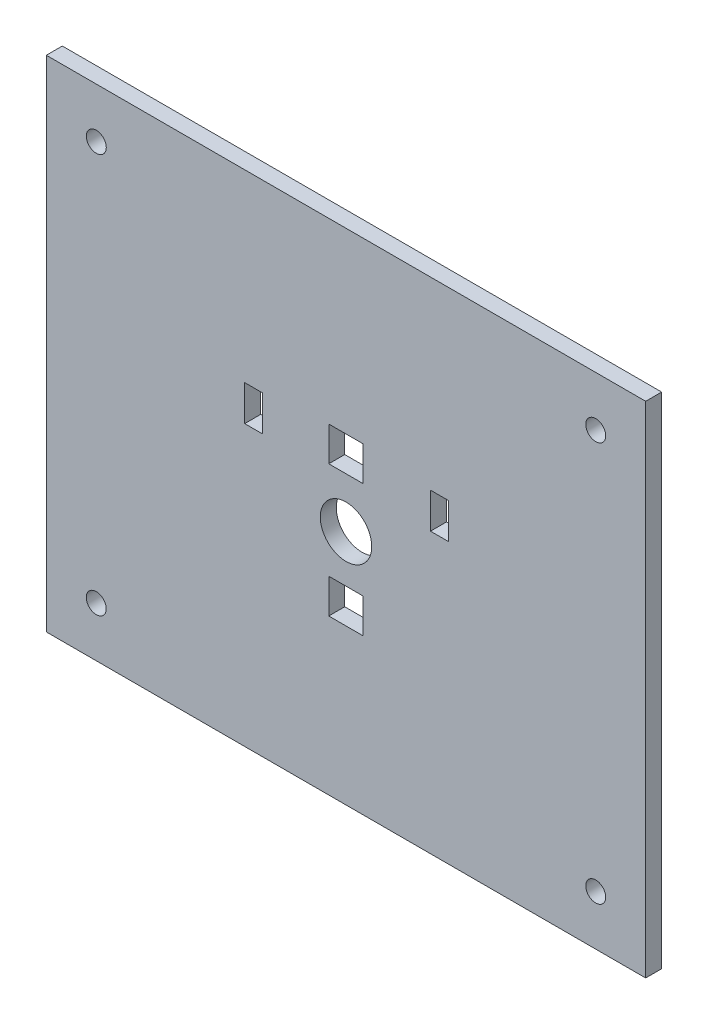
ISO-10303-21;
HEADER;
FILE_DESCRIPTION(('STEP AP214'),'2;1');
FILE_NAME('part.step','',(''),(''),'','','');
FILE_SCHEMA(('AUTOMOTIVE_DESIGN { 1 0 10303 214 1 1 1 1 }'));
ENDSEC;
DATA;
#1=APPLICATION_CONTEXT('core data for automotive mechanical design processes');
#2=APPLICATION_PROTOCOL_DEFINITION('international standard','automotive_design',2000,#1);
#3=PRODUCT_CONTEXT('',#1,'mechanical');
#4=PRODUCT('Part','Part','',(#3));
#5=PRODUCT_RELATED_PRODUCT_CATEGORY('part','',(#4));
#6=PRODUCT_DEFINITION_FORMATION('','',#4);
#7=PRODUCT_DEFINITION_CONTEXT('part definition',#1,'design');
#8=PRODUCT_DEFINITION('design','',#6,#7);
#9=PRODUCT_DEFINITION_SHAPE('','',#8);
#10=(LENGTH_UNIT() NAMED_UNIT(*) SI_UNIT(.MILLI.,.METRE.));
#11=(NAMED_UNIT(*) PLANE_ANGLE_UNIT() SI_UNIT($,.RADIAN.));
#12=(NAMED_UNIT(*) SI_UNIT($,.STERADIAN.) SOLID_ANGLE_UNIT());
#13=UNCERTAINTY_MEASURE_WITH_UNIT(LENGTH_MEASURE(1.E-05),#10,'distance_accuracy_value','');
#14=(GEOMETRIC_REPRESENTATION_CONTEXT(3) GLOBAL_UNCERTAINTY_ASSIGNED_CONTEXT((#13)) GLOBAL_UNIT_ASSIGNED_CONTEXT((#10,
#11,#12)) REPRESENTATION_CONTEXT('',''));
#15=CARTESIAN_POINT('',(0.,0.,0.));
#16=DIRECTION('',(0.,0.,1.));
#17=DIRECTION('',(1.,0.,0.));
#18=AXIS2_PLACEMENT_3D('',#15,#16,#17);
#19=CARTESIAN_POINT('',(0.,0.,1.6));
#20=DIRECTION('',(0.,0.,1.));
#21=DIRECTION('',(1.,0.,0.));
#22=AXIS2_PLACEMENT_3D('',#19,#20,#21);
#23=PLANE('',#22);
#24=CARTESIAN_POINT('',(137.002348606175,55.0046290037253,1.6));
#25=DIRECTION('',(0.,0.,1.));
#26=DIRECTION('',(1.,0.,0.));
#27=AXIS2_PLACEMENT_3D('',#24,#25,#26);
#28=CIRCLE('',#27,0.999999999999998);
#29=CARTESIAN_POINT('',(138.002348606175,55.0046290037253,1.6));
#30=VERTEX_POINT('',#29);
#31=EDGE_CURVE('E245',#30,#30,#28,.T.);
#32=ORIENTED_EDGE('',*,*,#31,.F.);
#33=EDGE_LOOP('',(#32));
#34=FACE_BOUND('',#33,.T.);
#35=DIRECTION('',(0.,-1.,0.));
#36=VECTOR('',#35,1.);
#37=CARTESIAN_POINT('',(101.86100024,77.9969992,1.6));
#38=LINE('',#37,#36);
#39=CARTESIAN_POINT('',(101.86100024,81.5529992,1.6));
#40=VERTEX_POINT('',#39);
#41=CARTESIAN_POINT('',(101.86100024,77.9969992,1.6));
#42=VERTEX_POINT('',#41);
#43=EDGE_CURVE('E259',#40,#42,#38,.T.);
#44=ORIENTED_EDGE('',*,*,#43,.F.);
#45=DIRECTION('',(-1.,0.,0.));
#46=VECTOR('',#45,1.);
#47=CARTESIAN_POINT('',(101.86100024,81.5529992,1.6));
#48=LINE('',#47,#46);
#49=CARTESIAN_POINT('',(103.63900024,81.5529992,1.6));
#50=VERTEX_POINT('',#49);
#51=EDGE_CURVE('E257',#50,#40,#48,.T.);
#52=ORIENTED_EDGE('',*,*,#51,.F.);
#53=DIRECTION('',(0.,1.,0.));
#54=VECTOR('',#53,1.);
#55=CARTESIAN_POINT('',(103.63900024,77.9969992,1.6));
#56=LINE('',#55,#54);
#57=CARTESIAN_POINT('',(103.63900024,77.9969992,1.6));
#58=VERTEX_POINT('',#57);
#59=EDGE_CURVE('E265',#58,#50,#56,.T.);
#60=ORIENTED_EDGE('',*,*,#59,.F.);
#61=DIRECTION('',(1.,0.,0.));
#62=VECTOR('',#61,1.);
#63=CARTESIAN_POINT('',(101.86100024,77.9969992,1.6));
#64=LINE('',#63,#62);
#65=EDGE_CURVE('E262',#42,#58,#64,.T.);
#66=ORIENTED_EDGE('',*,*,#65,.F.);
#67=EDGE_LOOP('',(#44,#52,#60,#66));
#68=FACE_BOUND('',#67,.T.);
#69=CARTESIAN_POINT('',(87.0023486061747,95.0046290037253,1.6));
#70=DIRECTION('',(0.,0.,1.));
#71=DIRECTION('',(1.,0.,0.));
#72=AXIS2_PLACEMENT_3D('',#69,#70,#71);
#73=CIRCLE('',#72,0.999999999999998);
#74=CARTESIAN_POINT('',(88.0023486061747,95.0046290037253,1.6));
#75=VERTEX_POINT('',#74);
#76=EDGE_CURVE('E288',#75,#75,#73,.T.);
#77=ORIENTED_EDGE('',*,*,#76,.F.);
#78=EDGE_LOOP('',(#77));
#79=FACE_BOUND('',#78,.T.);
#80=DIRECTION('',(-1.,0.,0.));
#81=VECTOR('',#80,1.);
#82=CARTESIAN_POINT('',(120.4609986,81.52800052,1.6));
#83=LINE('',#82,#81);
#84=CARTESIAN_POINT('',(122.2389986,81.52800052,1.6));
#85=VERTEX_POINT('',#84);
#86=CARTESIAN_POINT('',(120.4609986,81.52800052,1.6));
#87=VERTEX_POINT('',#86);
#88=EDGE_CURVE('E302',#85,#87,#83,.T.);
#89=ORIENTED_EDGE('',*,*,#88,.F.);
#90=DIRECTION('',(0.,1.,0.));
#91=VECTOR('',#90,1.);
#92=CARTESIAN_POINT('',(122.2389986,77.97200052,1.6));
#93=LINE('',#92,#91);
#94=CARTESIAN_POINT('',(122.2389986,77.97200052,1.6));
#95=VERTEX_POINT('',#94);
#96=EDGE_CURVE('E300',#95,#85,#93,.T.);
#97=ORIENTED_EDGE('',*,*,#96,.F.);
#98=DIRECTION('',(1.,0.,0.));
#99=VECTOR('',#98,1.);
#100=CARTESIAN_POINT('',(120.4609986,77.97200052,1.6));
#101=LINE('',#100,#99);
#102=CARTESIAN_POINT('',(120.4609986,77.97200052,1.6));
#103=VERTEX_POINT('',#102);
#104=EDGE_CURVE('E308',#103,#95,#101,.T.);
#105=ORIENTED_EDGE('',*,*,#104,.F.);
#106=DIRECTION('',(0.,-1.,0.));
#107=VECTOR('',#106,1.);
#108=CARTESIAN_POINT('',(120.4609986,77.97200052,1.6));
#109=LINE('',#108,#107);
#110=EDGE_CURVE('E305',#87,#103,#109,.T.);
#111=ORIENTED_EDGE('',*,*,#110,.F.);
#112=EDGE_LOOP('',(#89,#97,#105,#111));
#113=FACE_BOUND('',#112,.T.);
#114=DIRECTION('',(0.,1.,0.));
#115=VECTOR('',#114,1.);
#116=CARTESIAN_POINT('',(142.002348606175,100.004629003725,1.6));
#117=LINE('',#116,#115);
#118=CARTESIAN_POINT('',(142.002348606175,50.0046290037253,1.6));
#119=VERTEX_POINT('',#118);
#120=CARTESIAN_POINT('',(142.002348606175,100.004629003725,1.6));
#121=VERTEX_POINT('',#120);
#122=EDGE_CURVE('E331',#119,#121,#117,.T.);
#123=ORIENTED_EDGE('',*,*,#122,.T.);
#124=DIRECTION('',(-1.,0.,0.));
#125=VECTOR('',#124,1.);
#126=CARTESIAN_POINT('',(82.0023486061747,100.004629003725,1.6));
#127=LINE('',#126,#125);
#128=CARTESIAN_POINT('',(82.0023486061747,100.004629003725,1.6));
#129=VERTEX_POINT('',#128);
#130=EDGE_CURVE('E334',#121,#129,#127,.T.);
#131=ORIENTED_EDGE('',*,*,#130,.T.);
#132=DIRECTION('',(0.,-1.,0.));
#133=VECTOR('',#132,1.);
#134=CARTESIAN_POINT('',(82.0023486061747,100.004629003725,1.6));
#135=LINE('',#134,#133);
#136=CARTESIAN_POINT('',(82.0023486061747,50.0046290037253,1.6));
#137=VERTEX_POINT('',#136);
#138=EDGE_CURVE('E337',#129,#137,#135,.T.);
#139=ORIENTED_EDGE('',*,*,#138,.T.);
#140=DIRECTION('',(1.,0.,0.));
#141=VECTOR('',#140,1.);
#142=CARTESIAN_POINT('',(82.0023486061747,50.0046290037253,1.6));
#143=LINE('',#142,#141);
#144=EDGE_CURVE('E339',#137,#119,#143,.T.);
#145=ORIENTED_EDGE('',*,*,#144,.T.);
#146=EDGE_LOOP('',(#123,#131,#139,#145));
#147=FACE_BOUND('',#146,.T.);
#148=CARTESIAN_POINT('',(112.002348606175,73.693071841758,1.6));
#149=DIRECTION('',(0.,0.,1.));
#150=DIRECTION('',(1.,0.,0.));
#151=AXIS2_PLACEMENT_3D('',#148,#149,#150);
#152=CIRCLE('',#151,2.57574226018455);
#153=CARTESIAN_POINT('',(114.578090866359,73.693071841758,1.6));
#154=VERTEX_POINT('',#153);
#155=EDGE_CURVE('E294',#154,#154,#152,.T.);
#156=ORIENTED_EDGE('',*,*,#155,.F.);
#157=EDGE_LOOP('',(#156));
#158=FACE_BOUND('',#157,.T.);
#159=CARTESIAN_POINT('',(137.002348606175,95.0046290037253,1.6));
#160=DIRECTION('',(0.,0.,1.));
#161=DIRECTION('',(-1.,0.,0.));
#162=AXIS2_PLACEMENT_3D('',#159,#160,#161);
#163=CIRCLE('',#162,0.999999999999998);
#164=CARTESIAN_POINT('',(136.002348606175,95.0046290037253,1.6));
#165=VERTEX_POINT('',#164);
#166=EDGE_CURVE('E251',#165,#165,#163,.T.);
#167=ORIENTED_EDGE('',*,*,#166,.F.);
#168=EDGE_LOOP('',(#167));
#169=FACE_BOUND('',#168,.T.);
#170=CARTESIAN_POINT('',(87.0023486061747,55.0046290037253,1.6));
#171=DIRECTION('',(0.,0.,1.));
#172=DIRECTION('',(-1.,0.,0.));
#173=AXIS2_PLACEMENT_3D('',#170,#171,#172);
#174=CIRCLE('',#173,0.999999999999998);
#175=CARTESIAN_POINT('',(86.0023486061747,55.0046290037253,1.6));
#176=VERTEX_POINT('',#175);
#177=EDGE_CURVE('E239',#176,#176,#174,.T.);
#178=ORIENTED_EDGE('',*,*,#177,.F.);
#179=EDGE_LOOP('',(#178));
#180=FACE_BOUND('',#179,.T.);
#181=DIRECTION('',(1.,0.,0.));
#182=VECTOR('',#181,1.);
#183=CARTESIAN_POINT('',(110.27499916,78.7202007,1.6));
#184=LINE('',#183,#182);
#185=CARTESIAN_POINT('',(110.27499916,78.7202007,1.6));
#186=VERTEX_POINT('',#185);
#187=CARTESIAN_POINT('',(113.72499988,78.7202007,1.6));
#188=VERTEX_POINT('',#187);
#189=EDGE_CURVE('E210',#186,#188,#184,.T.);
#190=ORIENTED_EDGE('',*,*,#189,.F.);
#191=DIRECTION('',(0.,-1.,0.));
#192=VECTOR('',#191,1.);
#193=CARTESIAN_POINT('',(110.27499916,78.7202007,1.6));
#194=LINE('',#193,#192);
#195=CARTESIAN_POINT('',(110.27499916,82.17020142,1.6));
#196=VERTEX_POINT('',#195);
#197=EDGE_CURVE('E208',#196,#186,#194,.T.);
#198=ORIENTED_EDGE('',*,*,#197,.F.);
#199=DIRECTION('',(-1.,0.,0.));
#200=VECTOR('',#199,1.);
#201=CARTESIAN_POINT('',(110.27499916,82.17020142,1.6));
#202=LINE('',#201,#200);
#203=CARTESIAN_POINT('',(113.72499988,82.17020142,1.6));
#204=VERTEX_POINT('',#203);
#205=EDGE_CURVE('E216',#204,#196,#202,.T.);
#206=ORIENTED_EDGE('',*,*,#205,.F.);
#207=DIRECTION('',(0.,1.,0.));
#208=VECTOR('',#207,1.);
#209=CARTESIAN_POINT('',(113.72499988,78.7202007,1.6));
#210=LINE('',#209,#208);
#211=EDGE_CURVE('E213',#188,#204,#210,.T.);
#212=ORIENTED_EDGE('',*,*,#211,.F.);
#213=EDGE_LOOP('',(#190,#198,#206,#212));
#214=FACE_BOUND('',#213,.T.);
#215=DIRECTION('',(1.,0.,0.));
#216=VECTOR('',#215,1.);
#217=CARTESIAN_POINT('',(110.27499916,65.52499976,1.6));
#218=LINE('',#217,#216);
#219=CARTESIAN_POINT('',(110.27499916,65.52499976,1.6));
#220=VERTEX_POINT('',#219);
#221=CARTESIAN_POINT('',(113.72499988,65.52499976,1.6));
#222=VERTEX_POINT('',#221);
#223=EDGE_CURVE('E180',#220,#222,#218,.T.);
#224=ORIENTED_EDGE('',*,*,#223,.F.);
#225=DIRECTION('',(0.,-1.,0.));
#226=VECTOR('',#225,1.);
#227=CARTESIAN_POINT('',(110.27499916,65.52499976,1.6));
#228=LINE('',#227,#226);
#229=CARTESIAN_POINT('',(110.27499916,68.97500048,1.6));
#230=VERTEX_POINT('',#229);
#231=EDGE_CURVE('E172',#230,#220,#228,.T.);
#232=ORIENTED_EDGE('',*,*,#231,.F.);
#233=DIRECTION('',(-1.,0.,0.));
#234=VECTOR('',#233,1.);
#235=CARTESIAN_POINT('',(110.27499916,68.97500048,1.6));
#236=LINE('',#235,#234);
#237=CARTESIAN_POINT('',(113.72499988,68.97500048,1.6));
#238=VERTEX_POINT('',#237);
#239=EDGE_CURVE('E194',#238,#230,#236,.T.);
#240=ORIENTED_EDGE('',*,*,#239,.F.);
#241=DIRECTION('',(0.,1.,0.));
#242=VECTOR('',#241,1.);
#243=CARTESIAN_POINT('',(113.72499988,65.52499976,1.6));
#244=LINE('',#243,#242);
#245=EDGE_CURVE('E192',#222,#238,#244,.T.);
#246=ORIENTED_EDGE('',*,*,#245,.F.);
#247=EDGE_LOOP('',(#224,#232,#240,#246));
#248=FACE_BOUND('',#247,.T.);
#249=ADVANCED_FACE('F35',(#34,#68,#79,#113,#147,#158,#169,#180,#214,#248),#23,.T.);
#250=CARTESIAN_POINT('',(0.,0.,0.));
#251=DIRECTION('',(0.,0.,1.));
#252=DIRECTION('',(1.,0.,0.));
#253=AXIS2_PLACEMENT_3D('',#250,#251,#252);
#254=PLANE('',#253);
#255=DIRECTION('',(0.,-1.,0.));
#256=VECTOR('',#255,1.);
#257=CARTESIAN_POINT('',(110.27499916,78.7202007,0.));
#258=LINE('',#257,#256);
#259=CARTESIAN_POINT('',(110.27499916,82.17020142,0.));
#260=VERTEX_POINT('',#259);
#261=CARTESIAN_POINT('',(110.27499916,78.7202007,0.));
#262=VERTEX_POINT('',#261);
#263=EDGE_CURVE('E188',#260,#262,#258,.T.);
#264=ORIENTED_EDGE('',*,*,#263,.T.);
#265=DIRECTION('',(1.,0.,0.));
#266=VECTOR('',#265,1.);
#267=CARTESIAN_POINT('',(110.27499916,78.7202007,0.));
#268=LINE('',#267,#266);
#269=CARTESIAN_POINT('',(113.72499988,78.7202007,0.));
#270=VERTEX_POINT('',#269);
#271=EDGE_CURVE('E221',#262,#270,#268,.T.);
#272=ORIENTED_EDGE('',*,*,#271,.T.);
#273=DIRECTION('',(0.,1.,0.));
#274=VECTOR('',#273,1.);
#275=CARTESIAN_POINT('',(113.72499988,78.7202007,0.));
#276=LINE('',#275,#274);
#277=CARTESIAN_POINT('',(113.72499988,82.17020142,0.));
#278=VERTEX_POINT('',#277);
#279=EDGE_CURVE('E224',#270,#278,#276,.T.);
#280=ORIENTED_EDGE('',*,*,#279,.T.);
#281=DIRECTION('',(-1.,0.,0.));
#282=VECTOR('',#281,1.);
#283=CARTESIAN_POINT('',(110.27499916,82.17020142,0.));
#284=LINE('',#283,#282);
#285=EDGE_CURVE('E211',#278,#260,#284,.T.);
#286=ORIENTED_EDGE('',*,*,#285,.T.);
#287=EDGE_LOOP('',(#264,#272,#280,#286));
#288=FACE_BOUND('',#287,.T.);
#289=CARTESIAN_POINT('',(87.0023486061747,95.0046290037253,0.));
#290=DIRECTION('',(0.,0.,1.));
#291=DIRECTION('',(1.,0.,0.));
#292=AXIS2_PLACEMENT_3D('',#289,#290,#291);
#293=CIRCLE('',#292,0.999999999999998);
#294=CARTESIAN_POINT('',(88.0023486061747,95.0046290037253,0.));
#295=VERTEX_POINT('',#294);
#296=EDGE_CURVE('E287',#295,#295,#293,.T.);
#297=ORIENTED_EDGE('',*,*,#296,.T.);
#298=EDGE_LOOP('',(#297));
#299=FACE_BOUND('',#298,.T.);
#300=CARTESIAN_POINT('',(112.002348606175,73.693071841758,0.));
#301=DIRECTION('',(0.,0.,1.));
#302=DIRECTION('',(1.,0.,0.));
#303=AXIS2_PLACEMENT_3D('',#300,#301,#302);
#304=CIRCLE('',#303,2.57574226018455);
#305=CARTESIAN_POINT('',(114.578090866359,73.693071841758,0.));
#306=VERTEX_POINT('',#305);
#307=EDGE_CURVE('E291',#306,#306,#304,.T.);
#308=ORIENTED_EDGE('',*,*,#307,.T.);
#309=EDGE_LOOP('',(#308));
#310=FACE_BOUND('',#309,.T.);
#311=DIRECTION('',(0.,1.,0.));
#312=VECTOR('',#311,1.);
#313=CARTESIAN_POINT('',(122.2389986,77.97200052,0.));
#314=LINE('',#313,#312);
#315=CARTESIAN_POINT('',(122.2389986,77.97200052,0.));
#316=VERTEX_POINT('',#315);
#317=CARTESIAN_POINT('',(122.2389986,81.52800052,0.));
#318=VERTEX_POINT('',#317);
#319=EDGE_CURVE('E297',#316,#318,#314,.T.);
#320=ORIENTED_EDGE('',*,*,#319,.T.);
#321=DIRECTION('',(-1.,0.,0.));
#322=VECTOR('',#321,1.);
#323=CARTESIAN_POINT('',(120.4609986,81.52800052,0.));
#324=LINE('',#323,#322);
#325=CARTESIAN_POINT('',(120.4609986,81.52800052,0.));
#326=VERTEX_POINT('',#325);
#327=EDGE_CURVE('E313',#318,#326,#324,.T.);
#328=ORIENTED_EDGE('',*,*,#327,.T.);
#329=DIRECTION('',(0.,-1.,0.));
#330=VECTOR('',#329,1.);
#331=CARTESIAN_POINT('',(120.4609986,77.97200052,0.));
#332=LINE('',#331,#330);
#333=CARTESIAN_POINT('',(120.4609986,77.97200052,0.));
#334=VERTEX_POINT('',#333);
#335=EDGE_CURVE('E316',#326,#334,#332,.T.);
#336=ORIENTED_EDGE('',*,*,#335,.T.);
#337=DIRECTION('',(1.,0.,0.));
#338=VECTOR('',#337,1.);
#339=CARTESIAN_POINT('',(120.4609986,77.97200052,0.));
#340=LINE('',#339,#338);
#341=EDGE_CURVE('E303',#334,#316,#340,.T.);
#342=ORIENTED_EDGE('',*,*,#341,.T.);
#343=EDGE_LOOP('',(#320,#328,#336,#342));
#344=FACE_BOUND('',#343,.T.);
#345=DIRECTION('',(0.,1.,0.));
#346=VECTOR('',#345,1.);
#347=CARTESIAN_POINT('',(142.002348606175,100.004629003725,0.));
#348=LINE('',#347,#346);
#349=CARTESIAN_POINT('',(142.002348606175,50.0046290037253,0.));
#350=VERTEX_POINT('',#349);
#351=CARTESIAN_POINT('',(142.002348606175,100.004629003725,0.));
#352=VERTEX_POINT('',#351);
#353=EDGE_CURVE('E330',#350,#352,#348,.T.);
#354=ORIENTED_EDGE('',*,*,#353,.F.);
#355=DIRECTION('',(1.,0.,0.));
#356=VECTOR('',#355,1.);
#357=CARTESIAN_POINT('',(82.0023486061747,50.0046290037253,0.));
#358=LINE('',#357,#356);
#359=CARTESIAN_POINT('',(82.0023486061747,50.0046290037253,0.));
#360=VERTEX_POINT('',#359);
#361=EDGE_CURVE('E335',#360,#350,#358,.T.);
#362=ORIENTED_EDGE('',*,*,#361,.F.);
#363=DIRECTION('',(0.,-1.,0.));
#364=VECTOR('',#363,1.);
#365=CARTESIAN_POINT('',(82.0023486061747,100.004629003725,0.));
#366=LINE('',#365,#364);
#367=CARTESIAN_POINT('',(82.0023486061747,100.004629003725,0.));
#368=VERTEX_POINT('',#367);
#369=EDGE_CURVE('E346',#368,#360,#366,.T.);
#370=ORIENTED_EDGE('',*,*,#369,.F.);
#371=DIRECTION('',(-1.,0.,0.));
#372=VECTOR('',#371,1.);
#373=CARTESIAN_POINT('',(82.0023486061747,100.004629003725,0.));
#374=LINE('',#373,#372);
#375=EDGE_CURVE('E344',#352,#368,#374,.T.);
#376=ORIENTED_EDGE('',*,*,#375,.F.);
#377=EDGE_LOOP('',(#354,#362,#370,#376));
#378=FACE_BOUND('',#377,.T.);
#379=DIRECTION('',(-1.,0.,0.));
#380=VECTOR('',#379,1.);
#381=CARTESIAN_POINT('',(101.86100024,81.5529992,0.));
#382=LINE('',#381,#380);
#383=CARTESIAN_POINT('',(103.63900024,81.5529992,0.));
#384=VERTEX_POINT('',#383);
#385=CARTESIAN_POINT('',(101.86100024,81.5529992,0.));
#386=VERTEX_POINT('',#385);
#387=EDGE_CURVE('E254',#384,#386,#382,.T.);
#388=ORIENTED_EDGE('',*,*,#387,.T.);
#389=DIRECTION('',(0.,-1.,0.));
#390=VECTOR('',#389,1.);
#391=CARTESIAN_POINT('',(101.86100024,77.9969992,0.));
#392=LINE('',#391,#390);
#393=CARTESIAN_POINT('',(101.86100024,77.9969992,0.));
#394=VERTEX_POINT('',#393);
#395=EDGE_CURVE('E270',#386,#394,#392,.T.);
#396=ORIENTED_EDGE('',*,*,#395,.T.);
#397=DIRECTION('',(1.,0.,0.));
#398=VECTOR('',#397,1.);
#399=CARTESIAN_POINT('',(101.86100024,77.9969992,0.));
#400=LINE('',#399,#398);
#401=CARTESIAN_POINT('',(103.63900024,77.9969992,0.));
#402=VERTEX_POINT('',#401);
#403=EDGE_CURVE('E273',#394,#402,#400,.T.);
#404=ORIENTED_EDGE('',*,*,#403,.T.);
#405=DIRECTION('',(0.,1.,0.));
#406=VECTOR('',#405,1.);
#407=CARTESIAN_POINT('',(103.63900024,77.9969992,0.));
#408=LINE('',#407,#406);
#409=EDGE_CURVE('E260',#402,#384,#408,.T.);
#410=ORIENTED_EDGE('',*,*,#409,.T.);
#411=EDGE_LOOP('',(#388,#396,#404,#410));
#412=FACE_BOUND('',#411,.T.);
#413=CARTESIAN_POINT('',(137.002348606175,95.0046290037253,0.));
#414=DIRECTION('',(0.,0.,1.));
#415=DIRECTION('',(-1.,0.,0.));
#416=AXIS2_PLACEMENT_3D('',#413,#414,#415);
#417=CIRCLE('',#416,0.999999999999998);
#418=CARTESIAN_POINT('',(136.002348606175,95.0046290037253,0.));
#419=VERTEX_POINT('',#418);
#420=EDGE_CURVE('E248',#419,#419,#417,.T.);
#421=ORIENTED_EDGE('',*,*,#420,.T.);
#422=EDGE_LOOP('',(#421));
#423=FACE_BOUND('',#422,.T.);
#424=CARTESIAN_POINT('',(137.002348606175,55.0046290037253,0.));
#425=DIRECTION('',(0.,0.,1.));
#426=DIRECTION('',(1.,0.,0.));
#427=AXIS2_PLACEMENT_3D('',#424,#425,#426);
#428=CIRCLE('',#427,0.999999999999998);
#429=CARTESIAN_POINT('',(138.002348606175,55.0046290037253,0.));
#430=VERTEX_POINT('',#429);
#431=EDGE_CURVE('E242',#430,#430,#428,.T.);
#432=ORIENTED_EDGE('',*,*,#431,.T.);
#433=EDGE_LOOP('',(#432));
#434=FACE_BOUND('',#433,.T.);
#435=CARTESIAN_POINT('',(87.0023486061747,55.0046290037253,0.));
#436=DIRECTION('',(0.,0.,1.));
#437=DIRECTION('',(-1.,0.,0.));
#438=AXIS2_PLACEMENT_3D('',#435,#436,#437);
#439=CIRCLE('',#438,0.999999999999998);
#440=CARTESIAN_POINT('',(86.0023486061747,55.0046290037253,0.));
#441=VERTEX_POINT('',#440);
#442=EDGE_CURVE('E238',#441,#441,#439,.T.);
#443=ORIENTED_EDGE('',*,*,#442,.T.);
#444=EDGE_LOOP('',(#443));
#445=FACE_BOUND('',#444,.T.);
#446=DIRECTION('',(0.,-1.,0.));
#447=VECTOR('',#446,1.);
#448=CARTESIAN_POINT('',(110.27499916,65.52499976,0.));
#449=LINE('',#448,#447);
#450=CARTESIAN_POINT('',(110.27499916,68.97500048,0.));
#451=VERTEX_POINT('',#450);
#452=CARTESIAN_POINT('',(110.27499916,65.52499976,0.));
#453=VERTEX_POINT('',#452);
#454=EDGE_CURVE('E58',#451,#453,#449,.T.);
#455=ORIENTED_EDGE('',*,*,#454,.T.);
#456=DIRECTION('',(1.,0.,0.));
#457=VECTOR('',#456,1.);
#458=CARTESIAN_POINT('',(110.27499916,65.52499976,0.));
#459=LINE('',#458,#457);
#460=CARTESIAN_POINT('',(113.72499988,65.52499976,0.));
#461=VERTEX_POINT('',#460);
#462=EDGE_CURVE('E187',#453,#461,#459,.T.);
#463=ORIENTED_EDGE('',*,*,#462,.T.);
#464=DIRECTION('',(0.,1.,0.));
#465=VECTOR('',#464,1.);
#466=CARTESIAN_POINT('',(113.72499988,65.52499976,0.));
#467=LINE('',#466,#465);
#468=CARTESIAN_POINT('',(113.72499988,68.97500048,0.));
#469=VERTEX_POINT('',#468);
#470=EDGE_CURVE('E200',#461,#469,#467,.T.);
#471=ORIENTED_EDGE('',*,*,#470,.T.);
#472=DIRECTION('',(-1.,0.,0.));
#473=VECTOR('',#472,1.);
#474=CARTESIAN_POINT('',(110.27499916,68.97500048,0.));
#475=LINE('',#474,#473);
#476=EDGE_CURVE('E181',#469,#451,#475,.T.);
#477=ORIENTED_EDGE('',*,*,#476,.T.);
#478=EDGE_LOOP('',(#455,#463,#471,#477));
#479=FACE_BOUND('',#478,.T.);
#480=ADVANCED_FACE('F364',(#288,#299,#310,#344,#378,#412,#423,#434,#445,#479),#254,.F.);
#481=CARTESIAN_POINT('',(142.002348606175,100.004629003725,1.6));
#482=DIRECTION('',(-1.,0.,0.));
#483=DIRECTION('',(0.,0.,1.));
#484=AXIS2_PLACEMENT_3D('',#481,#482,#483);
#485=PLANE('',#484);
#486=ORIENTED_EDGE('',*,*,#353,.T.);
#487=DIRECTION('',(0.,0.,-1.));
#488=VECTOR('',#487,1.);
#489=CARTESIAN_POINT('',(142.002348606175,100.004629003725,1.6));
#490=LINE('',#489,#488);
#491=EDGE_CURVE('E11',#121,#352,#490,.T.);
#492=ORIENTED_EDGE('',*,*,#491,.F.);
#493=ORIENTED_EDGE('',*,*,#122,.F.);
#494=DIRECTION('',(0.,0.,-1.));
#495=VECTOR('',#494,1.);
#496=CARTESIAN_POINT('',(142.002348606175,50.0046290037253,1.6));
#497=LINE('',#496,#495);
#498=EDGE_CURVE('E341',#119,#350,#497,.T.);
#499=ORIENTED_EDGE('',*,*,#498,.T.);
#500=EDGE_LOOP('',(#486,#492,#493,#499));
#501=FACE_BOUND('',#500,.T.);
#502=ADVANCED_FACE('F37',(#501),#485,.F.);
#503=CARTESIAN_POINT('',(82.0023486061747,100.004629003725,1.6));
#504=DIRECTION('',(0.,-1.,0.));
#505=DIRECTION('',(0.,0.,-1.));
#506=AXIS2_PLACEMENT_3D('',#503,#504,#505);
#507=PLANE('',#506);
#508=ORIENTED_EDGE('',*,*,#375,.T.);
#509=DIRECTION('',(0.,0.,-1.));
#510=VECTOR('',#509,1.);
#511=CARTESIAN_POINT('',(82.0023486061747,100.004629003725,1.6));
#512=LINE('',#511,#510);
#513=EDGE_CURVE('E43',#129,#368,#512,.T.);
#514=ORIENTED_EDGE('',*,*,#513,.F.);
#515=ORIENTED_EDGE('',*,*,#130,.F.);
#516=ORIENTED_EDGE('',*,*,#491,.T.);
#517=EDGE_LOOP('',(#508,#514,#515,#516));
#518=FACE_BOUND('',#517,.T.);
#519=ADVANCED_FACE('F375',(#518),#507,.F.);
#520=CARTESIAN_POINT('',(82.0023486061747,100.004629003725,1.6));
#521=DIRECTION('',(1.,0.,0.));
#522=DIRECTION('',(0.,0.,-1.));
#523=AXIS2_PLACEMENT_3D('',#520,#521,#522);
#524=PLANE('',#523);
#525=ORIENTED_EDGE('',*,*,#369,.T.);
#526=DIRECTION('',(0.,0.,-1.));
#527=VECTOR('',#526,1.);
#528=CARTESIAN_POINT('',(82.0023486061747,50.0046290037253,1.6));
#529=LINE('',#528,#527);
#530=EDGE_CURVE('E351',#137,#360,#529,.T.);
#531=ORIENTED_EDGE('',*,*,#530,.F.);
#532=ORIENTED_EDGE('',*,*,#138,.F.);
#533=ORIENTED_EDGE('',*,*,#513,.T.);
#534=EDGE_LOOP('',(#525,#531,#532,#533));
#535=FACE_BOUND('',#534,.T.);
#536=ADVANCED_FACE('F358',(#535),#524,.F.);
#537=CARTESIAN_POINT('',(82.0023486061747,50.0046290037253,1.6));
#538=DIRECTION('',(0.,1.,0.));
#539=DIRECTION('',(0.,0.,1.));
#540=AXIS2_PLACEMENT_3D('',#537,#538,#539);
#541=PLANE('',#540);
#542=ORIENTED_EDGE('',*,*,#361,.T.);
#543=ORIENTED_EDGE('',*,*,#498,.F.);
#544=ORIENTED_EDGE('',*,*,#144,.F.);
#545=ORIENTED_EDGE('',*,*,#530,.T.);
#546=EDGE_LOOP('',(#542,#543,#544,#545));
#547=FACE_BOUND('',#546,.T.);
#548=ADVANCED_FACE('F368',(#547),#541,.F.);
#549=CARTESIAN_POINT('',(122.2389986,77.97200052,1.6));
#550=DIRECTION('',(-1.,0.,0.));
#551=DIRECTION('',(0.,0.,1.));
#552=AXIS2_PLACEMENT_3D('',#549,#550,#551);
#553=PLANE('',#552);
#554=ORIENTED_EDGE('',*,*,#319,.F.);
#555=DIRECTION('',(0.,0.,-1.));
#556=VECTOR('',#555,1.);
#557=CARTESIAN_POINT('',(122.2389986,77.97200052,1.6));
#558=LINE('',#557,#556);
#559=EDGE_CURVE('E310',#95,#316,#558,.T.);
#560=ORIENTED_EDGE('',*,*,#559,.F.);
#561=ORIENTED_EDGE('',*,*,#96,.T.);
#562=DIRECTION('',(0.,0.,-1.));
#563=VECTOR('',#562,1.);
#564=CARTESIAN_POINT('',(122.2389986,81.52800052,1.6));
#565=LINE('',#564,#563);
#566=EDGE_CURVE('E327',#85,#318,#565,.T.);
#567=ORIENTED_EDGE('',*,*,#566,.T.);
#568=EDGE_LOOP('',(#554,#560,#561,#567));
#569=FACE_BOUND('',#568,.T.);
#570=ADVANCED_FACE('F393',(#569),#553,.T.);
#571=CARTESIAN_POINT('',(120.4609986,81.52800052,1.6));
#572=DIRECTION('',(0.,-1.,0.));
#573=DIRECTION('',(0.,0.,-1.));
#574=AXIS2_PLACEMENT_3D('',#571,#572,#573);
#575=PLANE('',#574);
#576=ORIENTED_EDGE('',*,*,#327,.F.);
#577=ORIENTED_EDGE('',*,*,#566,.F.);
#578=ORIENTED_EDGE('',*,*,#88,.T.);
#579=DIRECTION('',(0.,0.,-1.));
#580=VECTOR('',#579,1.);
#581=CARTESIAN_POINT('',(120.4609986,81.52800052,1.6));
#582=LINE('',#581,#580);
#583=EDGE_CURVE('E325',#87,#326,#582,.T.);
#584=ORIENTED_EDGE('',*,*,#583,.T.);
#585=EDGE_LOOP('',(#576,#577,#578,#584));
#586=FACE_BOUND('',#585,.T.);
#587=ADVANCED_FACE('F400',(#586),#575,.T.);
#588=CARTESIAN_POINT('',(120.4609986,77.97200052,1.6));
#589=DIRECTION('',(1.,0.,0.));
#590=DIRECTION('',(0.,0.,-1.));
#591=AXIS2_PLACEMENT_3D('',#588,#589,#590);
#592=PLANE('',#591);
#593=ORIENTED_EDGE('',*,*,#335,.F.);
#594=ORIENTED_EDGE('',*,*,#583,.F.);
#595=ORIENTED_EDGE('',*,*,#110,.T.);
#596=DIRECTION('',(0.,0.,-1.));
#597=VECTOR('',#596,1.);
#598=CARTESIAN_POINT('',(120.4609986,77.97200052,1.6));
#599=LINE('',#598,#597);
#600=EDGE_CURVE('E323',#103,#334,#599,.T.);
#601=ORIENTED_EDGE('',*,*,#600,.T.);
#602=EDGE_LOOP('',(#593,#594,#595,#601));
#603=FACE_BOUND('',#602,.T.);
#604=ADVANCED_FACE('F405',(#603),#592,.T.);
#605=CARTESIAN_POINT('',(120.4609986,77.97200052,1.6));
#606=DIRECTION('',(0.,1.,0.));
#607=DIRECTION('',(0.,0.,1.));
#608=AXIS2_PLACEMENT_3D('',#605,#606,#607);
#609=PLANE('',#608);
#610=ORIENTED_EDGE('',*,*,#341,.F.);
#611=ORIENTED_EDGE('',*,*,#600,.F.);
#612=ORIENTED_EDGE('',*,*,#104,.T.);
#613=ORIENTED_EDGE('',*,*,#559,.T.);
#614=EDGE_LOOP('',(#610,#611,#612,#613));
#615=FACE_BOUND('',#614,.T.);
#616=ADVANCED_FACE('F413',(#615),#609,.T.);
#617=CARTESIAN_POINT('',(112.002348606175,73.693071841758,1.6));
#618=DIRECTION('',(0.,0.,-1.));
#619=DIRECTION('',(-1.,0.,0.));
#620=AXIS2_PLACEMENT_3D('',#617,#618,#619);
#621=CYLINDRICAL_SURFACE('',#620,2.57574226018455);
#622=ORIENTED_EDGE('',*,*,#155,.T.);
#623=EDGE_LOOP('',(#622));
#624=FACE_BOUND('',#623,.T.);
#625=ORIENTED_EDGE('',*,*,#307,.F.);
#626=EDGE_LOOP('',(#625));
#627=FACE_BOUND('',#626,.T.);
#628=ADVANCED_FACE('F426',(#624,#627),#621,.F.);
#629=CARTESIAN_POINT('',(87.0023486061747,95.0046290037253,1.6));
#630=DIRECTION('',(0.,0.,-1.));
#631=DIRECTION('',(-1.,0.,0.));
#632=AXIS2_PLACEMENT_3D('',#629,#630,#631);
#633=CYLINDRICAL_SURFACE('',#632,0.999999999999998);
#634=ORIENTED_EDGE('',*,*,#76,.T.);
#635=EDGE_LOOP('',(#634));
#636=FACE_BOUND('',#635,.T.);
#637=ORIENTED_EDGE('',*,*,#296,.F.);
#638=EDGE_LOOP('',(#637));
#639=FACE_BOUND('',#638,.T.);
#640=ADVANCED_FACE('F431',(#636,#639),#633,.F.);
#641=CARTESIAN_POINT('',(101.86100024,81.5529992,1.6));
#642=DIRECTION('',(0.,-1.,0.));
#643=DIRECTION('',(0.,0.,-1.));
#644=AXIS2_PLACEMENT_3D('',#641,#642,#643);
#645=PLANE('',#644);
#646=ORIENTED_EDGE('',*,*,#387,.F.);
#647=DIRECTION('',(0.,0.,-1.));
#648=VECTOR('',#647,1.);
#649=CARTESIAN_POINT('',(103.63900024,81.5529992,1.6));
#650=LINE('',#649,#648);
#651=EDGE_CURVE('E267',#50,#384,#650,.T.);
#652=ORIENTED_EDGE('',*,*,#651,.F.);
#653=ORIENTED_EDGE('',*,*,#51,.T.);
#654=DIRECTION('',(0.,0.,-1.));
#655=VECTOR('',#654,1.);
#656=CARTESIAN_POINT('',(101.86100024,81.5529992,1.6));
#657=LINE('',#656,#655);
#658=EDGE_CURVE('E284',#40,#386,#657,.T.);
#659=ORIENTED_EDGE('',*,*,#658,.T.);
#660=EDGE_LOOP('',(#646,#652,#653,#659));
#661=FACE_BOUND('',#660,.T.);
#662=ADVANCED_FACE('F435',(#661),#645,.T.);
#663=CARTESIAN_POINT('',(101.86100024,77.9969992,1.6));
#664=DIRECTION('',(1.,0.,0.));
#665=DIRECTION('',(0.,0.,-1.));
#666=AXIS2_PLACEMENT_3D('',#663,#664,#665);
#667=PLANE('',#666);
#668=ORIENTED_EDGE('',*,*,#395,.F.);
#669=ORIENTED_EDGE('',*,*,#658,.F.);
#670=ORIENTED_EDGE('',*,*,#43,.T.);
#671=DIRECTION('',(0.,0.,-1.));
#672=VECTOR('',#671,1.);
#673=CARTESIAN_POINT('',(101.86100024,77.9969992,1.6));
#674=LINE('',#673,#672);
#675=EDGE_CURVE('E282',#42,#394,#674,.T.);
#676=ORIENTED_EDGE('',*,*,#675,.T.);
#677=EDGE_LOOP('',(#668,#669,#670,#676));
#678=FACE_BOUND('',#677,.T.);
#679=ADVANCED_FACE('F439',(#678),#667,.T.);
#680=CARTESIAN_POINT('',(101.86100024,77.9969992,1.6));
#681=DIRECTION('',(0.,1.,0.));
#682=DIRECTION('',(0.,0.,1.));
#683=AXIS2_PLACEMENT_3D('',#680,#681,#682);
#684=PLANE('',#683);
#685=ORIENTED_EDGE('',*,*,#403,.F.);
#686=ORIENTED_EDGE('',*,*,#675,.F.);
#687=ORIENTED_EDGE('',*,*,#65,.T.);
#688=DIRECTION('',(0.,0.,-1.));
#689=VECTOR('',#688,1.);
#690=CARTESIAN_POINT('',(103.63900024,77.9969992,1.6));
#691=LINE('',#690,#689);
#692=EDGE_CURVE('E280',#58,#402,#691,.T.);
#693=ORIENTED_EDGE('',*,*,#692,.T.);
#694=EDGE_LOOP('',(#685,#686,#687,#693));
#695=FACE_BOUND('',#694,.T.);
#696=ADVANCED_FACE('F443',(#695),#684,.T.);
#697=CARTESIAN_POINT('',(103.63900024,77.9969992,1.6));
#698=DIRECTION('',(-1.,0.,0.));
#699=DIRECTION('',(0.,0.,1.));
#700=AXIS2_PLACEMENT_3D('',#697,#698,#699);
#701=PLANE('',#700);
#702=ORIENTED_EDGE('',*,*,#409,.F.);
#703=ORIENTED_EDGE('',*,*,#692,.F.);
#704=ORIENTED_EDGE('',*,*,#59,.T.);
#705=ORIENTED_EDGE('',*,*,#651,.T.);
#706=EDGE_LOOP('',(#702,#703,#704,#705));
#707=FACE_BOUND('',#706,.T.);
#708=ADVANCED_FACE('F447',(#707),#701,.T.);
#709=CARTESIAN_POINT('',(137.002348606175,95.0046290037253,1.6));
#710=DIRECTION('',(0.,0.,-1.));
#711=DIRECTION('',(-1.,0.,0.));
#712=AXIS2_PLACEMENT_3D('',#709,#710,#711);
#713=CYLINDRICAL_SURFACE('',#712,0.999999999999998);
#714=ORIENTED_EDGE('',*,*,#166,.T.);
#715=EDGE_LOOP('',(#714));
#716=FACE_BOUND('',#715,.T.);
#717=ORIENTED_EDGE('',*,*,#420,.F.);
#718=EDGE_LOOP('',(#717));
#719=FACE_BOUND('',#718,.T.);
#720=ADVANCED_FACE('F451',(#716,#719),#713,.F.);
#721=CARTESIAN_POINT('',(137.002348606175,55.0046290037253,1.6));
#722=DIRECTION('',(0.,0.,-1.));
#723=DIRECTION('',(-1.,0.,0.));
#724=AXIS2_PLACEMENT_3D('',#721,#722,#723);
#725=CYLINDRICAL_SURFACE('',#724,0.999999999999998);
#726=ORIENTED_EDGE('',*,*,#31,.T.);
#727=EDGE_LOOP('',(#726));
#728=FACE_BOUND('',#727,.T.);
#729=ORIENTED_EDGE('',*,*,#431,.F.);
#730=EDGE_LOOP('',(#729));
#731=FACE_BOUND('',#730,.T.);
#732=ADVANCED_FACE('F455',(#728,#731),#725,.F.);
#733=CARTESIAN_POINT('',(87.0023486061747,55.0046290037253,1.6));
#734=DIRECTION('',(0.,0.,-1.));
#735=DIRECTION('',(-1.,0.,0.));
#736=AXIS2_PLACEMENT_3D('',#733,#734,#735);
#737=CYLINDRICAL_SURFACE('',#736,0.999999999999998);
#738=ORIENTED_EDGE('',*,*,#177,.T.);
#739=EDGE_LOOP('',(#738));
#740=FACE_BOUND('',#739,.T.);
#741=ORIENTED_EDGE('',*,*,#442,.F.);
#742=EDGE_LOOP('',(#741));
#743=FACE_BOUND('',#742,.T.);
#744=ADVANCED_FACE('F459',(#740,#743),#737,.F.);
#745=CARTESIAN_POINT('',(110.27499916,78.7202007,1.6));
#746=DIRECTION('',(1.,0.,0.));
#747=DIRECTION('',(0.,0.,-1.));
#748=AXIS2_PLACEMENT_3D('',#745,#746,#747);
#749=PLANE('',#748);
#750=ORIENTED_EDGE('',*,*,#263,.F.);
#751=DIRECTION('',(0.,0.,-1.));
#752=VECTOR('',#751,1.);
#753=CARTESIAN_POINT('',(110.27499916,82.17020142,1.6));
#754=LINE('',#753,#752);
#755=EDGE_CURVE('E218',#196,#260,#754,.T.);
#756=ORIENTED_EDGE('',*,*,#755,.F.);
#757=ORIENTED_EDGE('',*,*,#197,.T.);
#758=DIRECTION('',(0.,0.,-1.));
#759=VECTOR('',#758,1.);
#760=CARTESIAN_POINT('',(110.27499916,78.7202007,1.6));
#761=LINE('',#760,#759);
#762=EDGE_CURVE('E235',#186,#262,#761,.T.);
#763=ORIENTED_EDGE('',*,*,#762,.T.);
#764=EDGE_LOOP('',(#750,#756,#757,#763));
#765=FACE_BOUND('',#764,.T.);
#766=ADVANCED_FACE('F463',(#765),#749,.T.);
#767=CARTESIAN_POINT('',(110.27499916,78.7202007,1.6));
#768=DIRECTION('',(0.,1.,0.));
#769=DIRECTION('',(0.,0.,1.));
#770=AXIS2_PLACEMENT_3D('',#767,#768,#769);
#771=PLANE('',#770);
#772=ORIENTED_EDGE('',*,*,#271,.F.);
#773=ORIENTED_EDGE('',*,*,#762,.F.);
#774=ORIENTED_EDGE('',*,*,#189,.T.);
#775=DIRECTION('',(0.,0.,-1.));
#776=VECTOR('',#775,1.);
#777=CARTESIAN_POINT('',(113.72499988,78.7202007,1.6));
#778=LINE('',#777,#776);
#779=EDGE_CURVE('E233',#188,#270,#778,.T.);
#780=ORIENTED_EDGE('',*,*,#779,.T.);
#781=EDGE_LOOP('',(#772,#773,#774,#780));
#782=FACE_BOUND('',#781,.T.);
#783=ADVANCED_FACE('F467',(#782),#771,.T.);
#784=CARTESIAN_POINT('',(113.72499988,78.7202007,1.6));
#785=DIRECTION('',(-1.,0.,0.));
#786=DIRECTION('',(0.,0.,1.));
#787=AXIS2_PLACEMENT_3D('',#784,#785,#786);
#788=PLANE('',#787);
#789=ORIENTED_EDGE('',*,*,#279,.F.);
#790=ORIENTED_EDGE('',*,*,#779,.F.);
#791=ORIENTED_EDGE('',*,*,#211,.T.);
#792=DIRECTION('',(0.,0.,-1.));
#793=VECTOR('',#792,1.);
#794=CARTESIAN_POINT('',(113.72499988,82.17020142,1.6));
#795=LINE('',#794,#793);
#796=EDGE_CURVE('E231',#204,#278,#795,.T.);
#797=ORIENTED_EDGE('',*,*,#796,.T.);
#798=EDGE_LOOP('',(#789,#790,#791,#797));
#799=FACE_BOUND('',#798,.T.);
#800=ADVANCED_FACE('F471',(#799),#788,.T.);
#801=CARTESIAN_POINT('',(110.27499916,82.17020142,1.6));
#802=DIRECTION('',(0.,-1.,0.));
#803=DIRECTION('',(0.,0.,-1.));
#804=AXIS2_PLACEMENT_3D('',#801,#802,#803);
#805=PLANE('',#804);
#806=ORIENTED_EDGE('',*,*,#285,.F.);
#807=ORIENTED_EDGE('',*,*,#796,.F.);
#808=ORIENTED_EDGE('',*,*,#205,.T.);
#809=ORIENTED_EDGE('',*,*,#755,.T.);
#810=EDGE_LOOP('',(#806,#807,#808,#809));
#811=FACE_BOUND('',#810,.T.);
#812=ADVANCED_FACE('F475',(#811),#805,.T.);
#813=CARTESIAN_POINT('',(110.27499916,65.52499976,1.6));
#814=DIRECTION('',(1.,0.,0.));
#815=DIRECTION('',(0.,0.,-1.));
#816=AXIS2_PLACEMENT_3D('',#813,#814,#815);
#817=PLANE('',#816);
#818=ORIENTED_EDGE('',*,*,#454,.F.);
#819=DIRECTION('',(0.,0.,-1.));
#820=VECTOR('',#819,1.);
#821=CARTESIAN_POINT('',(110.27499916,68.97500048,1.6));
#822=LINE('',#821,#820);
#823=EDGE_CURVE('E176',#230,#451,#822,.T.);
#824=ORIENTED_EDGE('',*,*,#823,.F.);
#825=ORIENTED_EDGE('',*,*,#231,.T.);
#826=DIRECTION('',(0.,0.,-1.));
#827=VECTOR('',#826,1.);
#828=CARTESIAN_POINT('',(110.27499916,65.52499976,1.6));
#829=LINE('',#828,#827);
#830=EDGE_CURVE('E175',#220,#453,#829,.T.);
#831=ORIENTED_EDGE('',*,*,#830,.T.);
#832=EDGE_LOOP('',(#818,#824,#825,#831));
#833=FACE_BOUND('',#832,.T.);
#834=ADVANCED_FACE('F174',(#833),#817,.T.);
#835=CARTESIAN_POINT('',(110.27499916,65.52499976,1.6));
#836=DIRECTION('',(0.,1.,0.));
#837=DIRECTION('',(0.,0.,1.));
#838=AXIS2_PLACEMENT_3D('',#835,#836,#837);
#839=PLANE('',#838);
#840=ORIENTED_EDGE('',*,*,#462,.F.);
#841=ORIENTED_EDGE('',*,*,#830,.F.);
#842=ORIENTED_EDGE('',*,*,#223,.T.);
#843=DIRECTION('',(0.,0.,-1.));
#844=VECTOR('',#843,1.);
#845=CARTESIAN_POINT('',(113.72499988,65.52499976,1.6));
#846=LINE('',#845,#844);
#847=EDGE_CURVE('E189',#222,#461,#846,.T.);
#848=ORIENTED_EDGE('',*,*,#847,.T.);
#849=EDGE_LOOP('',(#840,#841,#842,#848));
#850=FACE_BOUND('',#849,.T.);
#851=ADVANCED_FACE('F184',(#850),#839,.T.);
#852=CARTESIAN_POINT('',(113.72499988,65.52499976,1.6));
#853=DIRECTION('',(-1.,0.,0.));
#854=DIRECTION('',(0.,0.,1.));
#855=AXIS2_PLACEMENT_3D('',#852,#853,#854);
#856=PLANE('',#855);
#857=ORIENTED_EDGE('',*,*,#470,.F.);
#858=ORIENTED_EDGE('',*,*,#847,.F.);
#859=ORIENTED_EDGE('',*,*,#245,.T.);
#860=DIRECTION('',(0.,0.,-1.));
#861=VECTOR('',#860,1.);
#862=CARTESIAN_POINT('',(113.72499988,68.97500048,1.6));
#863=LINE('',#862,#861);
#864=EDGE_CURVE('E50',#238,#469,#863,.T.);
#865=ORIENTED_EDGE('',*,*,#864,.T.);
#866=EDGE_LOOP('',(#857,#858,#859,#865));
#867=FACE_BOUND('',#866,.T.);
#868=ADVANCED_FACE('F484',(#867),#856,.T.);
#869=CARTESIAN_POINT('',(110.27499916,68.97500048,1.6));
#870=DIRECTION('',(0.,-1.,0.));
#871=DIRECTION('',(0.,0.,-1.));
#872=AXIS2_PLACEMENT_3D('',#869,#870,#871);
#873=PLANE('',#872);
#874=ORIENTED_EDGE('',*,*,#476,.F.);
#875=ORIENTED_EDGE('',*,*,#864,.F.);
#876=ORIENTED_EDGE('',*,*,#239,.T.);
#877=ORIENTED_EDGE('',*,*,#823,.T.);
#878=EDGE_LOOP('',(#874,#875,#876,#877));
#879=FACE_BOUND('',#878,.T.);
#880=ADVANCED_FACE('F487',(#879),#873,.T.);
#881=CLOSED_SHELL('',(#249,#480,#502,#519,#536,#548,#570,#587,#604,#616,#628,#640,#662,#679,
#696,#708,#720,#732,#744,#766,#783,#800,#812,#834,#851,#868,#880));
#882=MANIFOLD_SOLID_BREP('B2',#881);
#883=ADVANCED_BREP_SHAPE_REPRESENTATION('',(#18,#882),#14);
#884=SHAPE_DEFINITION_REPRESENTATION(#9,#883);
ENDSEC;
END-ISO-10303-21;
